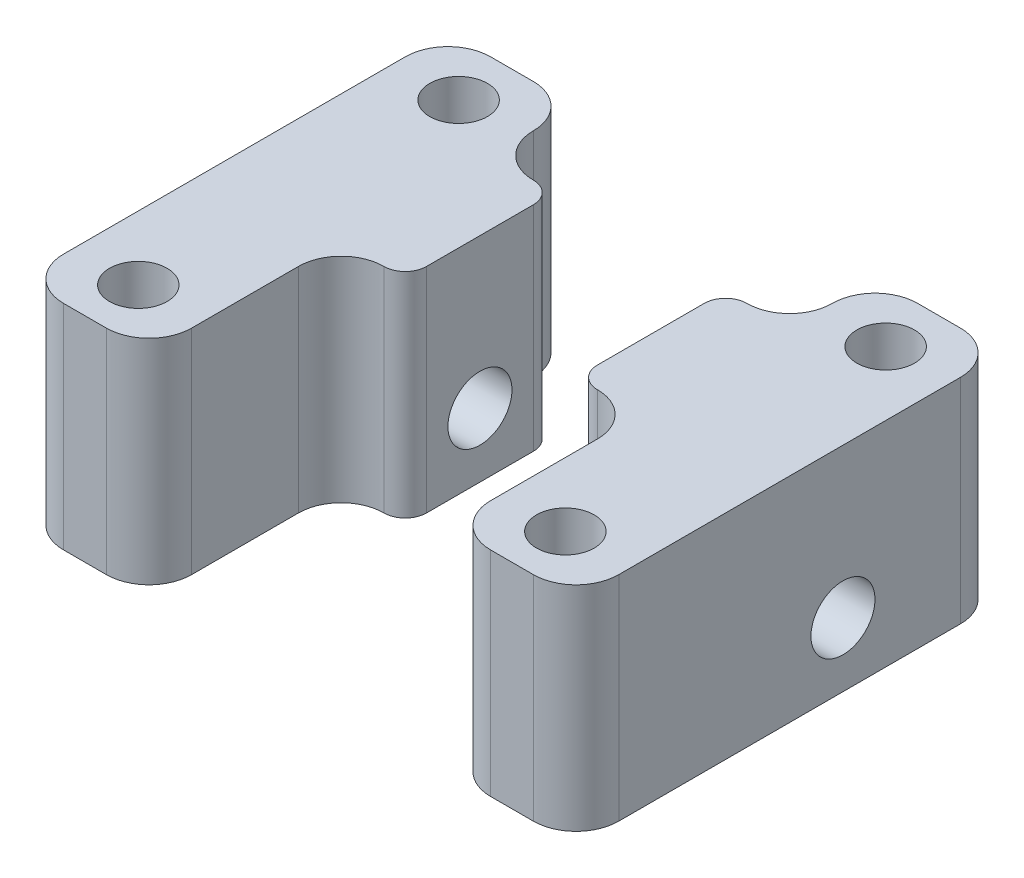
ISO-10303-21;
HEADER;
FILE_DESCRIPTION(('STEP AP214'),'2;1');
FILE_NAME('part.step','',(''),(''),'','','');
FILE_SCHEMA(('AUTOMOTIVE_DESIGN { 1 0 10303 214 1 1 1 1 }'));
ENDSEC;
DATA;
#1=APPLICATION_CONTEXT('core data for automotive mechanical design processes');
#2=APPLICATION_PROTOCOL_DEFINITION('international standard','automotive_design',2000,#1);
#3=PRODUCT_CONTEXT('',#1,'mechanical');
#4=PRODUCT('Part','Part','',(#3));
#5=PRODUCT_RELATED_PRODUCT_CATEGORY('part','',(#4));
#6=PRODUCT_DEFINITION_FORMATION('','',#4);
#7=PRODUCT_DEFINITION_CONTEXT('part definition',#1,'design');
#8=PRODUCT_DEFINITION('design','',#6,#7);
#9=PRODUCT_DEFINITION_SHAPE('','',#8);
#10=(LENGTH_UNIT() NAMED_UNIT(*) SI_UNIT(.MILLI.,.METRE.));
#11=(NAMED_UNIT(*) PLANE_ANGLE_UNIT() SI_UNIT($,.RADIAN.));
#12=(NAMED_UNIT(*) SI_UNIT($,.STERADIAN.) SOLID_ANGLE_UNIT());
#13=UNCERTAINTY_MEASURE_WITH_UNIT(LENGTH_MEASURE(1.E-05),#10,'distance_accuracy_value','');
#14=(GEOMETRIC_REPRESENTATION_CONTEXT(3) GLOBAL_UNCERTAINTY_ASSIGNED_CONTEXT((#13)) GLOBAL_UNIT_ASSIGNED_CONTEXT((#10,
#11,#12)) REPRESENTATION_CONTEXT('',''));
#15=CARTESIAN_POINT('',(0.,0.,0.));
#16=DIRECTION('',(0.,0.,1.));
#17=DIRECTION('',(1.,0.,0.));
#18=AXIS2_PLACEMENT_3D('',#15,#16,#17);
#19=CARTESIAN_POINT('',(0.,10.,0.));
#20=DIRECTION('',(0.,-1.,0.));
#21=DIRECTION('',(0.,0.,1.));
#22=AXIS2_PLACEMENT_3D('',#19,#20,#21);
#23=PLANE('',#22);
#24=CARTESIAN_POINT('',(-10.,10.,-7.5));
#25=DIRECTION('',(0.,-1.,0.));
#26=DIRECTION('',(0.,0.,1.));
#27=AXIS2_PLACEMENT_3D('',#24,#25,#26);
#28=CIRCLE('',#27,1.35);
#29=CARTESIAN_POINT('',(-10.,10.,-6.15));
#30=VERTEX_POINT('',#29);
#31=EDGE_CURVE('E162',#30,#30,#28,.T.);
#32=ORIENTED_EDGE('',*,*,#31,.T.);
#33=EDGE_LOOP('',(#32));
#34=FACE_BOUND('',#33,.T.);
#35=CARTESIAN_POINT('',(-10.,10.,7.5));
#36=DIRECTION('',(0.,-1.,0.));
#37=DIRECTION('',(0.,0.,-1.));
#38=AXIS2_PLACEMENT_3D('',#35,#36,#37);
#39=CIRCLE('',#38,1.35);
#40=CARTESIAN_POINT('',(-10.,10.,6.15));
#41=VERTEX_POINT('',#40);
#42=EDGE_CURVE('E219',#41,#41,#39,.T.);
#43=ORIENTED_EDGE('',*,*,#42,.T.);
#44=EDGE_LOOP('',(#43));
#45=FACE_BOUND('',#44,.T.);
#46=DIRECTION('',(0.,0.,1.));
#47=VECTOR('',#46,1.);
#48=CARTESIAN_POINT('',(-4.,10.,-6.));
#49=LINE('',#48,#47);
#50=CARTESIAN_POINT('',(-4.,10.,-5.));
#51=VERTEX_POINT('',#50);
#52=CARTESIAN_POINT('',(-4.,10.,0.));
#53=VERTEX_POINT('',#52);
#54=EDGE_CURVE('E206',#51,#53,#49,.T.);
#55=ORIENTED_EDGE('',*,*,#54,.F.);
#56=CARTESIAN_POINT('',(-5.,10.,-5.));
#57=DIRECTION('',(0.,1.,0.));
#58=DIRECTION('',(0.,0.,1.));
#59=AXIS2_PLACEMENT_3D('',#56,#57,#58);
#60=CIRCLE('',#59,1.);
#61=CARTESIAN_POINT('',(-5.,10.,-6.));
#62=VERTEX_POINT('',#61);
#63=EDGE_CURVE('E55',#62,#51,#60,.F.);
#64=ORIENTED_EDGE('',*,*,#63,.F.);
#65=CARTESIAN_POINT('',(-5.,10.,-8.));
#66=DIRECTION('',(0.,1.,0.));
#67=DIRECTION('',(0.,0.,1.));
#68=AXIS2_PLACEMENT_3D('',#65,#66,#67);
#69=CIRCLE('',#68,2.);
#70=CARTESIAN_POINT('',(-7.,10.,-8.));
#71=VERTEX_POINT('',#70);
#72=EDGE_CURVE('E190',#71,#62,#69,.T.);
#73=ORIENTED_EDGE('',*,*,#72,.F.);
#74=CARTESIAN_POINT('',(-9.,10.,-8.));
#75=DIRECTION('',(0.,1.,0.));
#76=DIRECTION('',(0.,0.,1.));
#77=AXIS2_PLACEMENT_3D('',#74,#75,#76);
#78=CIRCLE('',#77,2.);
#79=CARTESIAN_POINT('',(-9.,10.,-10.));
#80=VERTEX_POINT('',#79);
#81=EDGE_CURVE('E169',#80,#71,#78,.F.);
#82=ORIENTED_EDGE('',*,*,#81,.F.);
#83=DIRECTION('',(1.,0.,0.));
#84=VECTOR('',#83,1.);
#85=CARTESIAN_POINT('',(-13.,10.,-10.));
#86=LINE('',#85,#84);
#87=CARTESIAN_POINT('',(-11.,10.,-10.));
#88=VERTEX_POINT('',#87);
#89=EDGE_CURVE('E207',#88,#80,#86,.T.);
#90=ORIENTED_EDGE('',*,*,#89,.F.);
#91=CARTESIAN_POINT('',(-11.,10.,-8.));
#92=DIRECTION('',(0.,1.,0.));
#93=DIRECTION('',(0.,0.,1.));
#94=AXIS2_PLACEMENT_3D('',#91,#92,#93);
#95=CIRCLE('',#94,2.);
#96=CARTESIAN_POINT('',(-13.,10.,-8.));
#97=VERTEX_POINT('',#96);
#98=EDGE_CURVE('E175',#97,#88,#95,.F.);
#99=ORIENTED_EDGE('',*,*,#98,.F.);
#100=DIRECTION('',(0.,0.,-1.));
#101=VECTOR('',#100,1.);
#102=CARTESIAN_POINT('',(-13.,10.,-10.));
#103=LINE('',#102,#101);
#104=CARTESIAN_POINT('',(-13.,10.,8.));
#105=VERTEX_POINT('',#104);
#106=EDGE_CURVE('E221',#105,#97,#103,.T.);
#107=ORIENTED_EDGE('',*,*,#106,.F.);
#108=CARTESIAN_POINT('',(-11.,10.,8.));
#109=DIRECTION('',(0.,1.,0.));
#110=DIRECTION('',(0.,0.,1.));
#111=AXIS2_PLACEMENT_3D('',#108,#109,#110);
#112=CIRCLE('',#111,2.);
#113=CARTESIAN_POINT('',(-11.,10.,10.));
#114=VERTEX_POINT('',#113);
#115=EDGE_CURVE('E168',#114,#105,#112,.F.);
#116=ORIENTED_EDGE('',*,*,#115,.F.);
#117=DIRECTION('',(-1.,0.,0.));
#118=VECTOR('',#117,1.);
#119=CARTESIAN_POINT('',(-13.,10.,10.));
#120=LINE('',#119,#118);
#121=CARTESIAN_POINT('',(-9.,10.,10.));
#122=VERTEX_POINT('',#121);
#123=EDGE_CURVE('E167',#122,#114,#120,.T.);
#124=ORIENTED_EDGE('',*,*,#123,.F.);
#125=CARTESIAN_POINT('',(-9.,10.,8.));
#126=DIRECTION('',(0.,1.,0.));
#127=DIRECTION('',(0.,0.,1.));
#128=AXIS2_PLACEMENT_3D('',#125,#126,#127);
#129=CIRCLE('',#128,2.);
#130=CARTESIAN_POINT('',(-7.,10.,8.));
#131=VERTEX_POINT('',#130);
#132=EDGE_CURVE('E147',#131,#122,#129,.F.);
#133=ORIENTED_EDGE('',*,*,#132,.F.);
#134=DIRECTION('',(0.,0.,-1.));
#135=VECTOR('',#134,1.);
#136=CARTESIAN_POINT('',(-7.,10.,10.));
#137=LINE('',#136,#135);
#138=CARTESIAN_POINT('',(-7.,10.,3.));
#139=VERTEX_POINT('',#138);
#140=EDGE_CURVE('E155',#131,#139,#137,.T.);
#141=ORIENTED_EDGE('',*,*,#140,.T.);
#142=CARTESIAN_POINT('',(-5.,10.,3.));
#143=DIRECTION('',(0.,1.,0.));
#144=DIRECTION('',(0.,0.,1.));
#145=AXIS2_PLACEMENT_3D('',#142,#143,#144);
#146=CIRCLE('',#145,2.);
#147=CARTESIAN_POINT('',(-5.,10.,0.999999999999997));
#148=VERTEX_POINT('',#147);
#149=EDGE_CURVE('E185',#148,#139,#146,.T.);
#150=ORIENTED_EDGE('',*,*,#149,.F.);
#151=CARTESIAN_POINT('',(-5.,10.,0.));
#152=DIRECTION('',(0.,1.,0.));
#153=DIRECTION('',(0.,0.,1.));
#154=AXIS2_PLACEMENT_3D('',#151,#152,#153);
#155=CIRCLE('',#154,1.);
#156=EDGE_CURVE('E12',#53,#148,#155,.F.);
#157=ORIENTED_EDGE('',*,*,#156,.F.);
#158=EDGE_LOOP('',(#55,#64,#73,#82,#90,#99,#107,#116,#124,#133,#141,#150,#157));
#159=FACE_BOUND('',#158,.T.);
#160=ADVANCED_FACE('F47',(#34,#45,#159),#23,.F.);
#161=CARTESIAN_POINT('',(0.,0.,0.));
#162=DIRECTION('',(0.,-1.,0.));
#163=DIRECTION('',(0.,0.,1.));
#164=AXIS2_PLACEMENT_3D('',#161,#162,#163);
#165=PLANE('',#164);
#166=CARTESIAN_POINT('',(-5.,0.,3.));
#167=DIRECTION('',(0.,1.,0.));
#168=DIRECTION('',(0.,0.,1.));
#169=AXIS2_PLACEMENT_3D('',#166,#167,#168);
#170=CIRCLE('',#169,2.);
#171=CARTESIAN_POINT('',(-7.,0.,3.));
#172=VERTEX_POINT('',#171);
#173=CARTESIAN_POINT('',(-5.,0.,0.999999999999997));
#174=VERTEX_POINT('',#173);
#175=EDGE_CURVE('E182',#172,#174,#170,.F.);
#176=ORIENTED_EDGE('',*,*,#175,.F.);
#177=DIRECTION('',(0.,0.,-1.));
#178=VECTOR('',#177,1.);
#179=CARTESIAN_POINT('',(-7.,0.,10.));
#180=LINE('',#179,#178);
#181=CARTESIAN_POINT('',(-7.,0.,8.));
#182=VERTEX_POINT('',#181);
#183=EDGE_CURVE('E224',#182,#172,#180,.T.);
#184=ORIENTED_EDGE('',*,*,#183,.F.);
#185=CARTESIAN_POINT('',(-9.,0.,8.));
#186=DIRECTION('',(0.,1.,0.));
#187=DIRECTION('',(0.,0.,1.));
#188=AXIS2_PLACEMENT_3D('',#185,#186,#187);
#189=CIRCLE('',#188,2.);
#190=CARTESIAN_POINT('',(-9.,0.,10.));
#191=VERTEX_POINT('',#190);
#192=EDGE_CURVE('E150',#191,#182,#189,.T.);
#193=ORIENTED_EDGE('',*,*,#192,.F.);
#194=DIRECTION('',(-1.,0.,0.));
#195=VECTOR('',#194,1.);
#196=CARTESIAN_POINT('',(-13.,0.,10.));
#197=LINE('',#196,#195);
#198=CARTESIAN_POINT('',(-11.,0.,10.));
#199=VERTEX_POINT('',#198);
#200=EDGE_CURVE('E228',#191,#199,#197,.T.);
#201=ORIENTED_EDGE('',*,*,#200,.T.);
#202=CARTESIAN_POINT('',(-11.,0.,8.));
#203=DIRECTION('',(0.,1.,0.));
#204=DIRECTION('',(0.,0.,1.));
#205=AXIS2_PLACEMENT_3D('',#202,#203,#204);
#206=CIRCLE('',#205,2.);
#207=CARTESIAN_POINT('',(-13.,0.,8.));
#208=VERTEX_POINT('',#207);
#209=EDGE_CURVE('E259',#208,#199,#206,.T.);
#210=ORIENTED_EDGE('',*,*,#209,.F.);
#211=DIRECTION('',(0.,0.,-1.));
#212=VECTOR('',#211,1.);
#213=CARTESIAN_POINT('',(-13.,0.,-10.));
#214=LINE('',#213,#212);
#215=CARTESIAN_POINT('',(-13.,0.,-8.));
#216=VERTEX_POINT('',#215);
#217=EDGE_CURVE('E216',#208,#216,#214,.T.);
#218=ORIENTED_EDGE('',*,*,#217,.T.);
#219=CARTESIAN_POINT('',(-11.,0.,-8.));
#220=DIRECTION('',(0.,1.,0.));
#221=DIRECTION('',(0.,0.,1.));
#222=AXIS2_PLACEMENT_3D('',#219,#220,#221);
#223=CIRCLE('',#222,2.);
#224=CARTESIAN_POINT('',(-11.,0.,-10.));
#225=VERTEX_POINT('',#224);
#226=EDGE_CURVE('E252',#225,#216,#223,.T.);
#227=ORIENTED_EDGE('',*,*,#226,.F.);
#228=DIRECTION('',(1.,0.,0.));
#229=VECTOR('',#228,1.);
#230=CARTESIAN_POINT('',(-13.,0.,-10.));
#231=LINE('',#230,#229);
#232=CARTESIAN_POINT('',(-9.,0.,-10.));
#233=VERTEX_POINT('',#232);
#234=EDGE_CURVE('E220',#225,#233,#231,.T.);
#235=ORIENTED_EDGE('',*,*,#234,.T.);
#236=CARTESIAN_POINT('',(-9.,0.,-8.));
#237=DIRECTION('',(0.,1.,0.));
#238=DIRECTION('',(0.,0.,1.));
#239=AXIS2_PLACEMENT_3D('',#236,#237,#238);
#240=CIRCLE('',#239,2.);
#241=CARTESIAN_POINT('',(-7.,0.,-8.));
#242=VERTEX_POINT('',#241);
#243=EDGE_CURVE('E255',#242,#233,#240,.T.);
#244=ORIENTED_EDGE('',*,*,#243,.F.);
#245=CARTESIAN_POINT('',(-5.,0.,-8.));
#246=DIRECTION('',(0.,1.,0.));
#247=DIRECTION('',(0.,0.,1.));
#248=AXIS2_PLACEMENT_3D('',#245,#246,#247);
#249=CIRCLE('',#248,2.);
#250=CARTESIAN_POINT('',(-5.,0.,-6.));
#251=VERTEX_POINT('',#250);
#252=EDGE_CURVE('E187',#251,#242,#249,.F.);
#253=ORIENTED_EDGE('',*,*,#252,.F.);
#254=CARTESIAN_POINT('',(-5.,0.,-5.));
#255=DIRECTION('',(0.,1.,0.));
#256=DIRECTION('',(0.,0.,1.));
#257=AXIS2_PLACEMENT_3D('',#254,#255,#256);
#258=CIRCLE('',#257,1.);
#259=CARTESIAN_POINT('',(-4.,0.,-5.));
#260=VERTEX_POINT('',#259);
#261=EDGE_CURVE('E193',#260,#251,#258,.T.);
#262=ORIENTED_EDGE('',*,*,#261,.F.);
#263=DIRECTION('',(0.,0.,-1.));
#264=VECTOR('',#263,1.);
#265=CARTESIAN_POINT('',(-4.,0.,-6.));
#266=LINE('',#265,#264);
#267=CARTESIAN_POINT('',(-4.,0.,0.));
#268=VERTEX_POINT('',#267);
#269=EDGE_CURVE('E208',#268,#260,#266,.T.);
#270=ORIENTED_EDGE('',*,*,#269,.F.);
#271=CARTESIAN_POINT('',(-5.,0.,0.));
#272=DIRECTION('',(0.,1.,0.));
#273=DIRECTION('',(0.,0.,1.));
#274=AXIS2_PLACEMENT_3D('',#271,#272,#273);
#275=CIRCLE('',#274,1.);
#276=EDGE_CURVE('E199',#174,#268,#275,.T.);
#277=ORIENTED_EDGE('',*,*,#276,.F.);
#278=EDGE_LOOP('',(#176,#184,#193,#201,#210,#218,#227,#235,#244,#253,#262,#270,#277));
#279=FACE_BOUND('',#278,.T.);
#280=CARTESIAN_POINT('',(-10.,0.,-7.5));
#281=DIRECTION('',(0.,-1.,0.));
#282=DIRECTION('',(0.,0.,1.));
#283=AXIS2_PLACEMENT_3D('',#280,#281,#282);
#284=CIRCLE('',#283,1.35);
#285=CARTESIAN_POINT('',(-10.,0.,-6.15));
#286=VERTEX_POINT('',#285);
#287=EDGE_CURVE('E229',#286,#286,#284,.T.);
#288=ORIENTED_EDGE('',*,*,#287,.F.);
#289=EDGE_LOOP('',(#288));
#290=FACE_BOUND('',#289,.T.);
#291=CARTESIAN_POINT('',(-10.,0.,7.5));
#292=DIRECTION('',(0.,-1.,0.));
#293=DIRECTION('',(0.,0.,-1.));
#294=AXIS2_PLACEMENT_3D('',#291,#292,#293);
#295=CIRCLE('',#294,1.35);
#296=CARTESIAN_POINT('',(-10.,0.,6.15));
#297=VERTEX_POINT('',#296);
#298=EDGE_CURVE('E225',#297,#297,#295,.T.);
#299=ORIENTED_EDGE('',*,*,#298,.F.);
#300=EDGE_LOOP('',(#299));
#301=FACE_BOUND('',#300,.T.);
#302=ADVANCED_FACE('F279',(#279,#290,#301),#165,.T.);
#303=CARTESIAN_POINT('',(-13.,10.,10.));
#304=DIRECTION('',(0.,0.,-1.));
#305=DIRECTION('',(1.,0.,0.));
#306=AXIS2_PLACEMENT_3D('',#303,#304,#305);
#307=PLANE('',#306);
#308=ORIENTED_EDGE('',*,*,#200,.F.);
#309=DIRECTION('',(0.,1.,0.));
#310=VECTOR('',#309,1.);
#311=CARTESIAN_POINT('',(-9.,10.,10.));
#312=LINE('',#311,#310);
#313=EDGE_CURVE('E262',#122,#191,#312,.F.);
#314=ORIENTED_EDGE('',*,*,#313,.F.);
#315=ORIENTED_EDGE('',*,*,#123,.T.);
#316=DIRECTION('',(0.,-1.,0.));
#317=VECTOR('',#316,1.);
#318=CARTESIAN_POINT('',(-11.,10.,10.));
#319=LINE('',#318,#317);
#320=EDGE_CURVE('E264',#199,#114,#319,.F.);
#321=ORIENTED_EDGE('',*,*,#320,.F.);
#322=EDGE_LOOP('',(#308,#314,#315,#321));
#323=FACE_BOUND('',#322,.T.);
#324=ADVANCED_FACE('F289',(#323),#307,.F.);
#325=CARTESIAN_POINT('',(-13.,10.,-10.));
#326=DIRECTION('',(0.,0.,1.));
#327=DIRECTION('',(-1.,0.,0.));
#328=AXIS2_PLACEMENT_3D('',#325,#326,#327);
#329=PLANE('',#328);
#330=ORIENTED_EDGE('',*,*,#234,.F.);
#331=DIRECTION('',(0.,-1.,0.));
#332=VECTOR('',#331,1.);
#333=CARTESIAN_POINT('',(-11.,10.,-10.));
#334=LINE('',#333,#332);
#335=EDGE_CURVE('E172',#88,#225,#334,.T.);
#336=ORIENTED_EDGE('',*,*,#335,.F.);
#337=ORIENTED_EDGE('',*,*,#89,.T.);
#338=DIRECTION('',(0.,1.,0.));
#339=VECTOR('',#338,1.);
#340=CARTESIAN_POINT('',(-9.,10.,-10.));
#341=LINE('',#340,#339);
#342=EDGE_CURVE('E180',#233,#80,#341,.T.);
#343=ORIENTED_EDGE('',*,*,#342,.F.);
#344=EDGE_LOOP('',(#330,#336,#337,#343));
#345=FACE_BOUND('',#344,.T.);
#346=ADVANCED_FACE('F274',(#345),#329,.F.);
#347=CARTESIAN_POINT('',(-13.,10.,-10.));
#348=DIRECTION('',(1.,0.,0.));
#349=DIRECTION('',(0.,0.,1.));
#350=AXIS2_PLACEMENT_3D('',#347,#348,#349);
#351=PLANE('',#350);
#352=CARTESIAN_POINT('',(-13.,3.,-2.5));
#353=DIRECTION('',(-1.,0.,0.));
#354=DIRECTION('',(0.,0.,1.));
#355=AXIS2_PLACEMENT_3D('',#352,#353,#354);
#356=CIRCLE('',#355,1.5);
#357=CARTESIAN_POINT('',(-13.,3.,-0.999999999999998));
#358=VERTEX_POINT('',#357);
#359=EDGE_CURVE('E196',#358,#358,#356,.T.);
#360=ORIENTED_EDGE('',*,*,#359,.F.);
#361=EDGE_LOOP('',(#360));
#362=FACE_BOUND('',#361,.T.);
#363=ORIENTED_EDGE('',*,*,#106,.T.);
#364=DIRECTION('',(0.,-1.,0.));
#365=VECTOR('',#364,1.);
#366=CARTESIAN_POINT('',(-13.,10.,-8.));
#367=LINE('',#366,#365);
#368=EDGE_CURVE('E248',#216,#97,#367,.F.);
#369=ORIENTED_EDGE('',*,*,#368,.F.);
#370=ORIENTED_EDGE('',*,*,#217,.F.);
#371=DIRECTION('',(0.,-1.,0.));
#372=VECTOR('',#371,1.);
#373=CARTESIAN_POINT('',(-13.,10.,8.));
#374=LINE('',#373,#372);
#375=EDGE_CURVE('E250',#105,#208,#374,.T.);
#376=ORIENTED_EDGE('',*,*,#375,.F.);
#377=EDGE_LOOP('',(#363,#369,#370,#376));
#378=FACE_BOUND('',#377,.T.);
#379=ADVANCED_FACE('F284',(#362,#378),#351,.F.);
#380=CARTESIAN_POINT('',(-10.,10.,7.5));
#381=DIRECTION('',(0.,-1.,0.));
#382=DIRECTION('',(0.,0.,1.));
#383=AXIS2_PLACEMENT_3D('',#380,#381,#382);
#384=CYLINDRICAL_SURFACE('',#383,1.35);
#385=ORIENTED_EDGE('',*,*,#42,.F.);
#386=EDGE_LOOP('',(#385));
#387=FACE_BOUND('',#386,.T.);
#388=ORIENTED_EDGE('',*,*,#298,.T.);
#389=EDGE_LOOP('',(#388));
#390=FACE_BOUND('',#389,.T.);
#391=ADVANCED_FACE('F399',(#387,#390),#384,.F.);
#392=CARTESIAN_POINT('',(-10.,10.,-7.5));
#393=DIRECTION('',(0.,-1.,0.));
#394=DIRECTION('',(0.,0.,1.));
#395=AXIS2_PLACEMENT_3D('',#392,#393,#394);
#396=CYLINDRICAL_SURFACE('',#395,1.35);
#397=ORIENTED_EDGE('',*,*,#31,.F.);
#398=EDGE_LOOP('',(#397));
#399=FACE_BOUND('',#398,.T.);
#400=ORIENTED_EDGE('',*,*,#287,.T.);
#401=EDGE_LOOP('',(#400));
#402=FACE_BOUND('',#401,.T.);
#403=ADVANCED_FACE('F391',(#399,#402),#396,.F.);
#404=CARTESIAN_POINT('',(-7.,0.,10.));
#405=DIRECTION('',(-1.,0.,0.));
#406=DIRECTION('',(0.,0.,-1.));
#407=AXIS2_PLACEMENT_3D('',#404,#405,#406);
#408=PLANE('',#407);
#409=ORIENTED_EDGE('',*,*,#140,.F.);
#410=DIRECTION('',(0.,1.,0.));
#411=VECTOR('',#410,1.);
#412=CARTESIAN_POINT('',(-7.,0.,8.));
#413=LINE('',#412,#411);
#414=EDGE_CURVE('E143',#182,#131,#413,.T.);
#415=ORIENTED_EDGE('',*,*,#414,.F.);
#416=ORIENTED_EDGE('',*,*,#183,.T.);
#417=DIRECTION('',(0.,-1.,0.));
#418=VECTOR('',#417,1.);
#419=CARTESIAN_POINT('',(-7.,0.,3.));
#420=LINE('',#419,#418);
#421=EDGE_CURVE('E154',#139,#172,#420,.T.);
#422=ORIENTED_EDGE('',*,*,#421,.F.);
#423=EDGE_LOOP('',(#409,#415,#416,#422));
#424=FACE_BOUND('',#423,.T.);
#425=ADVANCED_FACE('F158',(#424),#408,.F.);
#426=CARTESIAN_POINT('',(-4.,17.6157731058639,-6.));
#427=DIRECTION('',(1.,0.,0.));
#428=DIRECTION('',(0.,0.,1.));
#429=AXIS2_PLACEMENT_3D('',#426,#427,#428);
#430=PLANE('',#429);
#431=CARTESIAN_POINT('',(-4.,3.,-2.5));
#432=DIRECTION('',(-1.,0.,0.));
#433=DIRECTION('',(0.,0.,1.));
#434=AXIS2_PLACEMENT_3D('',#431,#432,#433);
#435=CIRCLE('',#434,1.5);
#436=CARTESIAN_POINT('',(-4.,3.,-0.999999999999998));
#437=VERTEX_POINT('',#436);
#438=EDGE_CURVE('E212',#437,#437,#435,.T.);
#439=ORIENTED_EDGE('',*,*,#438,.T.);
#440=EDGE_LOOP('',(#439));
#441=FACE_BOUND('',#440,.T.);
#442=ORIENTED_EDGE('',*,*,#269,.T.);
#443=DIRECTION('',(0.,-1.,0.));
#444=VECTOR('',#443,1.);
#445=CARTESIAN_POINT('',(-4.,17.6157731058639,-5.));
#446=LINE('',#445,#444);
#447=EDGE_CURVE('E69',#51,#260,#446,.T.);
#448=ORIENTED_EDGE('',*,*,#447,.F.);
#449=ORIENTED_EDGE('',*,*,#54,.T.);
#450=DIRECTION('',(0.,-1.,0.));
#451=VECTOR('',#450,1.);
#452=CARTESIAN_POINT('',(-4.,17.6157731058639,0.));
#453=LINE('',#452,#451);
#454=EDGE_CURVE('E61',#268,#53,#453,.F.);
#455=ORIENTED_EDGE('',*,*,#454,.F.);
#456=EDGE_LOOP('',(#442,#448,#449,#455));
#457=FACE_BOUND('',#456,.T.);
#458=ADVANCED_FACE('F374',(#441,#457),#430,.T.);
#459=CARTESIAN_POINT('',(-13.,3.,-2.5));
#460=DIRECTION('',(1.,0.,0.));
#461=DIRECTION('',(0.,0.,1.));
#462=AXIS2_PLACEMENT_3D('',#459,#460,#461);
#463=CYLINDRICAL_SURFACE('',#462,1.5);
#464=ORIENTED_EDGE('',*,*,#438,.F.);
#465=EDGE_LOOP('',(#464));
#466=FACE_BOUND('',#465,.T.);
#467=ORIENTED_EDGE('',*,*,#359,.T.);
#468=EDGE_LOOP('',(#467));
#469=FACE_BOUND('',#468,.T.);
#470=ADVANCED_FACE('F314',(#466,#469),#463,.F.);
#471=CARTESIAN_POINT('',(-5.,0.,3.));
#472=DIRECTION('',(0.,-1.,0.));
#473=DIRECTION('',(0.,0.,1.));
#474=AXIS2_PLACEMENT_3D('',#471,#472,#473);
#475=CYLINDRICAL_SURFACE('',#474,2.);
#476=ORIENTED_EDGE('',*,*,#149,.T.);
#477=ORIENTED_EDGE('',*,*,#421,.T.);
#478=ORIENTED_EDGE('',*,*,#175,.T.);
#479=DIRECTION('',(0.,-1.,0.));
#480=VECTOR('',#479,1.);
#481=CARTESIAN_POINT('',(-5.,17.6157731058639,0.999999999999997));
#482=LINE('',#481,#480);
#483=EDGE_CURVE('E245',#174,#148,#482,.F.);
#484=ORIENTED_EDGE('',*,*,#483,.T.);
#485=EDGE_LOOP('',(#476,#477,#478,#484));
#486=FACE_BOUND('',#485,.T.);
#487=ADVANCED_FACE('F293',(#486),#475,.F.);
#488=CARTESIAN_POINT('',(-9.,10.,-8.));
#489=DIRECTION('',(0.,1.,0.));
#490=DIRECTION('',(0.,0.,-1.));
#491=AXIS2_PLACEMENT_3D('',#488,#489,#490);
#492=CYLINDRICAL_SURFACE('',#491,2.);
#493=DIRECTION('',(0.,1.,0.));
#494=VECTOR('',#493,1.);
#495=CARTESIAN_POINT('',(-7.,0.,-8.));
#496=LINE('',#495,#494);
#497=EDGE_CURVE('E194',#71,#242,#496,.F.);
#498=ORIENTED_EDGE('',*,*,#497,.T.);
#499=ORIENTED_EDGE('',*,*,#243,.T.);
#500=ORIENTED_EDGE('',*,*,#342,.T.);
#501=ORIENTED_EDGE('',*,*,#81,.T.);
#502=EDGE_LOOP('',(#498,#499,#500,#501));
#503=FACE_BOUND('',#502,.T.);
#504=ADVANCED_FACE('F313',(#503),#492,.T.);
#505=CARTESIAN_POINT('',(-5.,17.6157731058639,-8.));
#506=DIRECTION('',(0.,-1.,0.));
#507=DIRECTION('',(0.,0.,1.));
#508=AXIS2_PLACEMENT_3D('',#505,#506,#507);
#509=CYLINDRICAL_SURFACE('',#508,2.);
#510=ORIENTED_EDGE('',*,*,#72,.T.);
#511=DIRECTION('',(0.,-1.,0.));
#512=VECTOR('',#511,1.);
#513=CARTESIAN_POINT('',(-5.,17.6157731058639,-6.));
#514=LINE('',#513,#512);
#515=EDGE_CURVE('E204',#62,#251,#514,.T.);
#516=ORIENTED_EDGE('',*,*,#515,.T.);
#517=ORIENTED_EDGE('',*,*,#252,.T.);
#518=ORIENTED_EDGE('',*,*,#497,.F.);
#519=EDGE_LOOP('',(#510,#516,#517,#518));
#520=FACE_BOUND('',#519,.T.);
#521=ADVANCED_FACE('F315',(#520),#509,.F.);
#522=CARTESIAN_POINT('',(-11.,10.,8.));
#523=DIRECTION('',(0.,-1.,0.));
#524=DIRECTION('',(0.,0.,1.));
#525=AXIS2_PLACEMENT_3D('',#522,#523,#524);
#526=CYLINDRICAL_SURFACE('',#525,2.);
#527=ORIENTED_EDGE('',*,*,#115,.T.);
#528=ORIENTED_EDGE('',*,*,#375,.T.);
#529=ORIENTED_EDGE('',*,*,#209,.T.);
#530=ORIENTED_EDGE('',*,*,#320,.T.);
#531=EDGE_LOOP('',(#527,#528,#529,#530));
#532=FACE_BOUND('',#531,.T.);
#533=ADVANCED_FACE('F286',(#532),#526,.T.);
#534=CARTESIAN_POINT('',(-9.,0.,8.));
#535=DIRECTION('',(0.,1.,0.));
#536=DIRECTION('',(0.,0.,-1.));
#537=AXIS2_PLACEMENT_3D('',#534,#535,#536);
#538=CYLINDRICAL_SURFACE('',#537,2.);
#539=ORIENTED_EDGE('',*,*,#192,.T.);
#540=ORIENTED_EDGE('',*,*,#414,.T.);
#541=ORIENTED_EDGE('',*,*,#132,.T.);
#542=ORIENTED_EDGE('',*,*,#313,.T.);
#543=EDGE_LOOP('',(#539,#540,#541,#542));
#544=FACE_BOUND('',#543,.T.);
#545=ADVANCED_FACE('F145',(#544),#538,.T.);
#546=CARTESIAN_POINT('',(-11.,10.,-8.));
#547=DIRECTION('',(0.,-1.,0.));
#548=DIRECTION('',(0.,0.,1.));
#549=AXIS2_PLACEMENT_3D('',#546,#547,#548);
#550=CYLINDRICAL_SURFACE('',#549,2.);
#551=ORIENTED_EDGE('',*,*,#98,.T.);
#552=ORIENTED_EDGE('',*,*,#335,.T.);
#553=ORIENTED_EDGE('',*,*,#226,.T.);
#554=ORIENTED_EDGE('',*,*,#368,.T.);
#555=EDGE_LOOP('',(#551,#552,#553,#554));
#556=FACE_BOUND('',#555,.T.);
#557=ADVANCED_FACE('F269',(#556),#550,.T.);
#558=CARTESIAN_POINT('',(-5.,17.6157731058639,0.));
#559=DIRECTION('',(0.,-1.,0.));
#560=DIRECTION('',(0.,0.,1.));
#561=AXIS2_PLACEMENT_3D('',#558,#559,#560);
#562=CYLINDRICAL_SURFACE('',#561,1.);
#563=ORIENTED_EDGE('',*,*,#156,.T.);
#564=ORIENTED_EDGE('',*,*,#483,.F.);
#565=ORIENTED_EDGE('',*,*,#276,.T.);
#566=ORIENTED_EDGE('',*,*,#454,.T.);
#567=EDGE_LOOP('',(#563,#564,#565,#566));
#568=FACE_BOUND('',#567,.T.);
#569=ADVANCED_FACE('F294',(#568),#562,.T.);
#570=CARTESIAN_POINT('',(-5.,17.6157731058639,-5.));
#571=DIRECTION('',(0.,-1.,0.));
#572=DIRECTION('',(0.,0.,1.));
#573=AXIS2_PLACEMENT_3D('',#570,#571,#572);
#574=CYLINDRICAL_SURFACE('',#573,1.);
#575=ORIENTED_EDGE('',*,*,#63,.T.);
#576=ORIENTED_EDGE('',*,*,#447,.T.);
#577=ORIENTED_EDGE('',*,*,#261,.T.);
#578=ORIENTED_EDGE('',*,*,#515,.F.);
#579=EDGE_LOOP('',(#575,#576,#577,#578));
#580=FACE_BOUND('',#579,.T.);
#581=ADVANCED_FACE('F49',(#580),#574,.T.);
#582=CLOSED_SHELL('',(#160,#302,#324,#346,#379,#391,#403,#425,#458,#470,#487,#504,#521,#533,
#545,#557,#569,#581));
#583=MANIFOLD_SOLID_BREP('B2',#582);
#584=CARTESIAN_POINT('',(7.,0.,10.));
#585=DIRECTION('',(1.,0.,0.));
#586=DIRECTION('',(0.,0.,1.));
#587=AXIS2_PLACEMENT_3D('',#584,#585,#586);
#588=PLANE('',#587);
#589=DIRECTION('',(0.,0.,1.));
#590=VECTOR('',#589,1.);
#591=CARTESIAN_POINT('',(7.,0.,10.));
#592=LINE('',#591,#590);
#593=CARTESIAN_POINT('',(7.,0.,3.));
#594=VERTEX_POINT('',#593);
#595=CARTESIAN_POINT('',(7.,0.,8.));
#596=VERTEX_POINT('',#595);
#597=EDGE_CURVE('E688',#594,#596,#592,.T.);
#598=ORIENTED_EDGE('',*,*,#597,.T.);
#599=DIRECTION('',(0.,1.,0.));
#600=VECTOR('',#599,1.);
#601=CARTESIAN_POINT('',(7.,0.,8.));
#602=LINE('',#601,#600);
#603=CARTESIAN_POINT('',(7.,10.,8.));
#604=VERTEX_POINT('',#603);
#605=EDGE_CURVE('E575',#604,#596,#602,.F.);
#606=ORIENTED_EDGE('',*,*,#605,.F.);
#607=DIRECTION('',(0.,0.,1.));
#608=VECTOR('',#607,1.);
#609=CARTESIAN_POINT('',(7.,10.,10.));
#610=LINE('',#609,#608);
#611=CARTESIAN_POINT('',(7.,10.,3.));
#612=VERTEX_POINT('',#611);
#613=EDGE_CURVE('E690',#612,#604,#610,.T.);
#614=ORIENTED_EDGE('',*,*,#613,.F.);
#615=DIRECTION('',(0.,-1.,0.));
#616=VECTOR('',#615,1.);
#617=CARTESIAN_POINT('',(7.,0.,3.));
#618=LINE('',#617,#616);
#619=EDGE_CURVE('E588',#594,#612,#618,.F.);
#620=ORIENTED_EDGE('',*,*,#619,.F.);
#621=EDGE_LOOP('',(#598,#606,#614,#620));
#622=FACE_BOUND('',#621,.T.);
#623=ADVANCED_FACE('F474',(#622),#588,.F.);
#624=CARTESIAN_POINT('',(10.,10.,7.5));
#625=DIRECTION('',(0.,-1.,0.));
#626=DIRECTION('',(0.,0.,1.));
#627=AXIS2_PLACEMENT_3D('',#624,#625,#626);
#628=CYLINDRICAL_SURFACE('',#627,1.35);
#629=CARTESIAN_POINT('',(10.,10.,7.5));
#630=DIRECTION('',(0.,-1.,0.));
#631=DIRECTION('',(0.,0.,1.));
#632=AXIS2_PLACEMENT_3D('',#629,#630,#631);
#633=CIRCLE('',#632,1.35);
#634=CARTESIAN_POINT('',(10.,10.,8.85));
#635=VERTEX_POINT('',#634);
#636=EDGE_CURVE('E674',#635,#635,#633,.T.);
#637=ORIENTED_EDGE('',*,*,#636,.F.);
#638=EDGE_LOOP('',(#637));
#639=FACE_BOUND('',#638,.T.);
#640=CARTESIAN_POINT('',(10.,0.,7.5));
#641=DIRECTION('',(0.,-1.,0.));
#642=DIRECTION('',(0.,0.,1.));
#643=AXIS2_PLACEMENT_3D('',#640,#641,#642);
#644=CIRCLE('',#643,1.35);
#645=CARTESIAN_POINT('',(10.,0.,8.85));
#646=VERTEX_POINT('',#645);
#647=EDGE_CURVE('E700',#646,#646,#644,.T.);
#648=ORIENTED_EDGE('',*,*,#647,.T.);
#649=EDGE_LOOP('',(#648));
#650=FACE_BOUND('',#649,.T.);
#651=ADVANCED_FACE('F737',(#639,#650),#628,.F.);
#652=CARTESIAN_POINT('',(10.,10.,-7.5));
#653=DIRECTION('',(0.,-1.,0.));
#654=DIRECTION('',(0.,0.,1.));
#655=AXIS2_PLACEMENT_3D('',#652,#653,#654);
#656=CYLINDRICAL_SURFACE('',#655,1.35);
#657=CARTESIAN_POINT('',(10.,10.,-7.5));
#658=DIRECTION('',(0.,-1.,0.));
#659=DIRECTION('',(0.,0.,-1.));
#660=AXIS2_PLACEMENT_3D('',#657,#658,#659);
#661=CIRCLE('',#660,1.35);
#662=CARTESIAN_POINT('',(10.,10.,-8.85));
#663=VERTEX_POINT('',#662);
#664=EDGE_CURVE('E693',#663,#663,#661,.T.);
#665=ORIENTED_EDGE('',*,*,#664,.F.);
#666=EDGE_LOOP('',(#665));
#667=FACE_BOUND('',#666,.T.);
#668=CARTESIAN_POINT('',(10.,0.,-7.5));
#669=DIRECTION('',(0.,-1.,0.));
#670=DIRECTION('',(0.,0.,-1.));
#671=AXIS2_PLACEMENT_3D('',#668,#669,#670);
#672=CIRCLE('',#671,1.35);
#673=CARTESIAN_POINT('',(10.,0.,-8.85));
#674=VERTEX_POINT('',#673);
#675=EDGE_CURVE('E689',#674,#674,#672,.T.);
#676=ORIENTED_EDGE('',*,*,#675,.T.);
#677=EDGE_LOOP('',(#676));
#678=FACE_BOUND('',#677,.T.);
#679=ADVANCED_FACE('F742',(#667,#678),#656,.F.);
#680=CARTESIAN_POINT('',(13.,10.,-10.));
#681=DIRECTION('',(-1.,0.,0.));
#682=DIRECTION('',(0.,0.,-1.));
#683=AXIS2_PLACEMENT_3D('',#680,#681,#682);
#684=PLANE('',#683);
#685=CARTESIAN_POINT('',(13.,3.,-2.5));
#686=DIRECTION('',(-1.,0.,0.));
#687=DIRECTION('',(0.,0.,1.));
#688=AXIS2_PLACEMENT_3D('',#685,#686,#687);
#689=CIRCLE('',#688,1.5);
#690=CARTESIAN_POINT('',(13.,3.,-0.999999999999998));
#691=VERTEX_POINT('',#690);
#692=EDGE_CURVE('E604',#691,#691,#689,.T.);
#693=ORIENTED_EDGE('',*,*,#692,.T.);
#694=EDGE_LOOP('',(#693));
#695=FACE_BOUND('',#694,.T.);
#696=DIRECTION('',(0.,0.,1.));
#697=VECTOR('',#696,1.);
#698=CARTESIAN_POINT('',(13.,10.,-10.));
#699=LINE('',#698,#697);
#700=CARTESIAN_POINT('',(13.,10.,-8.));
#701=VERTEX_POINT('',#700);
#702=CARTESIAN_POINT('',(13.,10.,8.));
#703=VERTEX_POINT('',#702);
#704=EDGE_CURVE('E672',#701,#703,#699,.T.);
#705=ORIENTED_EDGE('',*,*,#704,.T.);
#706=DIRECTION('',(0.,-1.,0.));
#707=VECTOR('',#706,1.);
#708=CARTESIAN_POINT('',(13.,10.,8.));
#709=LINE('',#708,#707);
#710=CARTESIAN_POINT('',(13.,0.,8.));
#711=VERTEX_POINT('',#710);
#712=EDGE_CURVE('E621',#711,#703,#709,.F.);
#713=ORIENTED_EDGE('',*,*,#712,.F.);
#714=DIRECTION('',(0.,0.,1.));
#715=VECTOR('',#714,1.);
#716=CARTESIAN_POINT('',(13.,0.,-10.));
#717=LINE('',#716,#715);
#718=CARTESIAN_POINT('',(13.,0.,-8.));
#719=VERTEX_POINT('',#718);
#720=EDGE_CURVE('E669',#719,#711,#717,.T.);
#721=ORIENTED_EDGE('',*,*,#720,.F.);
#722=DIRECTION('',(0.,-1.,0.));
#723=VECTOR('',#722,1.);
#724=CARTESIAN_POINT('',(13.,10.,-8.));
#725=LINE('',#724,#723);
#726=EDGE_CURVE('E624',#701,#719,#725,.T.);
#727=ORIENTED_EDGE('',*,*,#726,.F.);
#728=EDGE_LOOP('',(#705,#713,#721,#727));
#729=FACE_BOUND('',#728,.T.);
#730=ADVANCED_FACE('F750',(#695,#729),#684,.F.);
#731=CARTESIAN_POINT('',(-13.,10.,-10.));
#732=DIRECTION('',(0.,0.,1.));
#733=DIRECTION('',(-1.,0.,0.));
#734=AXIS2_PLACEMENT_3D('',#731,#732,#733);
#735=PLANE('',#734);
#736=DIRECTION('',(1.,0.,0.));
#737=VECTOR('',#736,1.);
#738=CARTESIAN_POINT('',(-13.,0.,-10.));
#739=LINE('',#738,#737);
#740=CARTESIAN_POINT('',(8.99999999999999,0.,-10.));
#741=VERTEX_POINT('',#740);
#742=CARTESIAN_POINT('',(11.,0.,-10.));
#743=VERTEX_POINT('',#742);
#744=EDGE_CURVE('E668',#741,#743,#739,.T.);
#745=ORIENTED_EDGE('',*,*,#744,.F.);
#746=DIRECTION('',(0.,1.,0.));
#747=VECTOR('',#746,1.);
#748=CARTESIAN_POINT('',(9.,10.,-10.));
#749=LINE('',#748,#747);
#750=CARTESIAN_POINT('',(8.99999999999999,10.,-10.));
#751=VERTEX_POINT('',#750);
#752=EDGE_CURVE('E639',#751,#741,#749,.F.);
#753=ORIENTED_EDGE('',*,*,#752,.F.);
#754=DIRECTION('',(1.,0.,0.));
#755=VECTOR('',#754,1.);
#756=CARTESIAN_POINT('',(-13.,10.,-10.));
#757=LINE('',#756,#755);
#758=CARTESIAN_POINT('',(11.,10.,-10.));
#759=VERTEX_POINT('',#758);
#760=EDGE_CURVE('E576',#751,#759,#757,.T.);
#761=ORIENTED_EDGE('',*,*,#760,.T.);
#762=DIRECTION('',(0.,-1.,0.));
#763=VECTOR('',#762,1.);
#764=CARTESIAN_POINT('',(11.,10.,-10.));
#765=LINE('',#764,#763);
#766=EDGE_CURVE('E642',#743,#759,#765,.F.);
#767=ORIENTED_EDGE('',*,*,#766,.F.);
#768=EDGE_LOOP('',(#745,#753,#761,#767));
#769=FACE_BOUND('',#768,.T.);
#770=ADVANCED_FACE('F714',(#769),#735,.F.);
#771=CARTESIAN_POINT('',(-13.,10.,10.));
#772=DIRECTION('',(0.,0.,-1.));
#773=DIRECTION('',(1.,0.,0.));
#774=AXIS2_PLACEMENT_3D('',#771,#772,#773);
#775=PLANE('',#774);
#776=DIRECTION('',(-1.,0.,0.));
#777=VECTOR('',#776,1.);
#778=CARTESIAN_POINT('',(-13.,10.,10.));
#779=LINE('',#778,#777);
#780=CARTESIAN_POINT('',(11.,10.,10.));
#781=VERTEX_POINT('',#780);
#782=CARTESIAN_POINT('',(9.,10.,10.));
#783=VERTEX_POINT('',#782);
#784=EDGE_CURVE('E708',#781,#783,#779,.T.);
#785=ORIENTED_EDGE('',*,*,#784,.T.);
#786=DIRECTION('',(0.,1.,0.));
#787=VECTOR('',#786,1.);
#788=CARTESIAN_POINT('',(9.,10.,10.));
#789=LINE('',#788,#787);
#790=CARTESIAN_POINT('',(9.,0.,10.));
#791=VERTEX_POINT('',#790);
#792=EDGE_CURVE('E652',#791,#783,#789,.T.);
#793=ORIENTED_EDGE('',*,*,#792,.F.);
#794=DIRECTION('',(-1.,0.,0.));
#795=VECTOR('',#794,1.);
#796=CARTESIAN_POINT('',(-13.,0.,10.));
#797=LINE('',#796,#795);
#798=CARTESIAN_POINT('',(11.,0.,10.));
#799=VERTEX_POINT('',#798);
#800=EDGE_CURVE('E665',#799,#791,#797,.T.);
#801=ORIENTED_EDGE('',*,*,#800,.F.);
#802=DIRECTION('',(0.,-1.,0.));
#803=VECTOR('',#802,1.);
#804=CARTESIAN_POINT('',(11.,10.,10.));
#805=LINE('',#804,#803);
#806=EDGE_CURVE('E596',#781,#799,#805,.T.);
#807=ORIENTED_EDGE('',*,*,#806,.F.);
#808=EDGE_LOOP('',(#785,#793,#801,#807));
#809=FACE_BOUND('',#808,.T.);
#810=ADVANCED_FACE('F666',(#809),#775,.F.);
#811=CARTESIAN_POINT('',(0.,0.,0.));
#812=DIRECTION('',(0.,-1.,0.));
#813=DIRECTION('',(0.,0.,1.));
#814=AXIS2_PLACEMENT_3D('',#811,#812,#813);
#815=PLANE('',#814);
#816=DIRECTION('',(0.,0.,1.));
#817=VECTOR('',#816,1.);
#818=CARTESIAN_POINT('',(4.,0.,-6.));
#819=LINE('',#818,#817);
#820=CARTESIAN_POINT('',(4.,0.,-5.));
#821=VERTEX_POINT('',#820);
#822=CARTESIAN_POINT('',(4.,0.,0.));
#823=VERTEX_POINT('',#822);
#824=EDGE_CURVE('E680',#821,#823,#819,.T.);
#825=ORIENTED_EDGE('',*,*,#824,.F.);
#826=CARTESIAN_POINT('',(5.,0.,-5.));
#827=DIRECTION('',(0.,1.,0.));
#828=DIRECTION('',(0.,0.,1.));
#829=AXIS2_PLACEMENT_3D('',#826,#827,#828);
#830=CIRCLE('',#829,1.);
#831=CARTESIAN_POINT('',(5.,0.,-6.));
#832=VERTEX_POINT('',#831);
#833=EDGE_CURVE('E607',#832,#821,#830,.T.);
#834=ORIENTED_EDGE('',*,*,#833,.F.);
#835=CARTESIAN_POINT('',(5.,0.,-8.));
#836=DIRECTION('',(0.,1.,0.));
#837=DIRECTION('',(0.,0.,1.));
#838=AXIS2_PLACEMENT_3D('',#835,#836,#837);
#839=CIRCLE('',#838,2.);
#840=CARTESIAN_POINT('',(7.,0.,-8.));
#841=VERTEX_POINT('',#840);
#842=EDGE_CURVE('E590',#841,#832,#839,.F.);
#843=ORIENTED_EDGE('',*,*,#842,.F.);
#844=CARTESIAN_POINT('',(9.,0.,-8.));
#845=DIRECTION('',(0.,1.,0.));
#846=DIRECTION('',(0.,0.,1.));
#847=AXIS2_PLACEMENT_3D('',#844,#845,#846);
#848=CIRCLE('',#847,2.);
#849=EDGE_CURVE('E631',#741,#841,#848,.T.);
#850=ORIENTED_EDGE('',*,*,#849,.F.);
#851=ORIENTED_EDGE('',*,*,#744,.T.);
#852=CARTESIAN_POINT('',(11.,0.,-8.));
#853=DIRECTION('',(0.,1.,0.));
#854=DIRECTION('',(0.,0.,1.));
#855=AXIS2_PLACEMENT_3D('',#852,#853,#854);
#856=CIRCLE('',#855,2.);
#857=EDGE_CURVE('E637',#719,#743,#856,.T.);
#858=ORIENTED_EDGE('',*,*,#857,.F.);
#859=ORIENTED_EDGE('',*,*,#720,.T.);
#860=CARTESIAN_POINT('',(11.,0.,8.));
#861=DIRECTION('',(0.,1.,0.));
#862=DIRECTION('',(0.,0.,1.));
#863=AXIS2_PLACEMENT_3D('',#860,#861,#862);
#864=CIRCLE('',#863,2.);
#865=EDGE_CURVE('E635',#799,#711,#864,.T.);
#866=ORIENTED_EDGE('',*,*,#865,.F.);
#867=ORIENTED_EDGE('',*,*,#800,.T.);
#868=CARTESIAN_POINT('',(9.,0.,8.));
#869=DIRECTION('',(0.,1.,0.));
#870=DIRECTION('',(0.,0.,1.));
#871=AXIS2_PLACEMENT_3D('',#868,#869,#870);
#872=CIRCLE('',#871,2.);
#873=EDGE_CURVE('E633',#596,#791,#872,.T.);
#874=ORIENTED_EDGE('',*,*,#873,.F.);
#875=ORIENTED_EDGE('',*,*,#597,.F.);
#876=CARTESIAN_POINT('',(5.,0.,3.));
#877=DIRECTION('',(0.,1.,0.));
#878=DIRECTION('',(0.,0.,1.));
#879=AXIS2_PLACEMENT_3D('',#876,#877,#878);
#880=CIRCLE('',#879,2.);
#881=CARTESIAN_POINT('',(5.,0.,0.999999999999997));
#882=VERTEX_POINT('',#881);
#883=EDGE_CURVE('E591',#882,#594,#880,.F.);
#884=ORIENTED_EDGE('',*,*,#883,.F.);
#885=CARTESIAN_POINT('',(5.,0.,0.));
#886=DIRECTION('',(0.,1.,0.));
#887=DIRECTION('',(0.,0.,1.));
#888=AXIS2_PLACEMENT_3D('',#885,#886,#887);
#889=CIRCLE('',#888,1.);
#890=EDGE_CURVE('E571',#823,#882,#889,.T.);
#891=ORIENTED_EDGE('',*,*,#890,.F.);
#892=EDGE_LOOP('',(#825,#834,#843,#850,#851,#858,#859,#866,#867,#874,#875,#884,#891));
#893=FACE_BOUND('',#892,.T.);
#894=ORIENTED_EDGE('',*,*,#675,.F.);
#895=EDGE_LOOP('',(#894));
#896=FACE_BOUND('',#895,.T.);
#897=ORIENTED_EDGE('',*,*,#647,.F.);
#898=EDGE_LOOP('',(#897));
#899=FACE_BOUND('',#898,.T.);
#900=ADVANCED_FACE('F721',(#893,#896,#899),#815,.T.);
#901=CARTESIAN_POINT('',(0.,10.,0.));
#902=DIRECTION('',(0.,-1.,0.));
#903=DIRECTION('',(0.,0.,1.));
#904=AXIS2_PLACEMENT_3D('',#901,#902,#903);
#905=PLANE('',#904);
#906=CARTESIAN_POINT('',(5.,10.,3.));
#907=DIRECTION('',(0.,1.,0.));
#908=DIRECTION('',(0.,0.,1.));
#909=AXIS2_PLACEMENT_3D('',#906,#907,#908);
#910=CIRCLE('',#909,2.);
#911=CARTESIAN_POINT('',(5.,10.,0.999999999999997));
#912=VERTEX_POINT('',#911);
#913=EDGE_CURVE('E582',#612,#912,#910,.T.);
#914=ORIENTED_EDGE('',*,*,#913,.F.);
#915=ORIENTED_EDGE('',*,*,#613,.T.);
#916=CARTESIAN_POINT('',(9.,10.,8.));
#917=DIRECTION('',(0.,1.,0.));
#918=DIRECTION('',(0.,0.,1.));
#919=AXIS2_PLACEMENT_3D('',#916,#917,#918);
#920=CIRCLE('',#919,2.);
#921=EDGE_CURVE('E646',#783,#604,#920,.F.);
#922=ORIENTED_EDGE('',*,*,#921,.F.);
#923=ORIENTED_EDGE('',*,*,#784,.F.);
#924=CARTESIAN_POINT('',(11.,10.,8.));
#925=DIRECTION('',(0.,1.,0.));
#926=DIRECTION('',(0.,0.,1.));
#927=AXIS2_PLACEMENT_3D('',#924,#925,#926);
#928=CIRCLE('',#927,2.);
#929=EDGE_CURVE('E648',#703,#781,#928,.F.);
#930=ORIENTED_EDGE('',*,*,#929,.F.);
#931=ORIENTED_EDGE('',*,*,#704,.F.);
#932=CARTESIAN_POINT('',(11.,10.,-8.));
#933=DIRECTION('',(0.,1.,0.));
#934=DIRECTION('',(0.,0.,1.));
#935=AXIS2_PLACEMENT_3D('',#932,#933,#934);
#936=CIRCLE('',#935,2.);
#937=EDGE_CURVE('E650',#759,#701,#936,.F.);
#938=ORIENTED_EDGE('',*,*,#937,.F.);
#939=ORIENTED_EDGE('',*,*,#760,.F.);
#940=CARTESIAN_POINT('',(9.,10.,-8.));
#941=DIRECTION('',(0.,1.,0.));
#942=DIRECTION('',(0.,0.,1.));
#943=AXIS2_PLACEMENT_3D('',#940,#941,#942);
#944=CIRCLE('',#943,2.);
#945=CARTESIAN_POINT('',(7.,10.,-8.));
#946=VERTEX_POINT('',#945);
#947=EDGE_CURVE('E615',#946,#751,#944,.F.);
#948=ORIENTED_EDGE('',*,*,#947,.F.);
#949=CARTESIAN_POINT('',(5.,10.,-8.));
#950=DIRECTION('',(0.,1.,0.));
#951=DIRECTION('',(0.,0.,1.));
#952=AXIS2_PLACEMENT_3D('',#949,#950,#951);
#953=CIRCLE('',#952,2.);
#954=CARTESIAN_POINT('',(5.,10.,-6.));
#955=VERTEX_POINT('',#954);
#956=EDGE_CURVE('E594',#955,#946,#953,.T.);
#957=ORIENTED_EDGE('',*,*,#956,.F.);
#958=CARTESIAN_POINT('',(5.,10.,-5.));
#959=DIRECTION('',(0.,1.,0.));
#960=DIRECTION('',(0.,0.,1.));
#961=AXIS2_PLACEMENT_3D('',#958,#959,#960);
#962=CIRCLE('',#961,1.);
#963=CARTESIAN_POINT('',(4.,10.,-5.));
#964=VERTEX_POINT('',#963);
#965=EDGE_CURVE('E482',#964,#955,#962,.F.);
#966=ORIENTED_EDGE('',*,*,#965,.F.);
#967=DIRECTION('',(0.,0.,-1.));
#968=VECTOR('',#967,1.);
#969=CARTESIAN_POINT('',(4.,10.,-6.));
#970=LINE('',#969,#968);
#971=CARTESIAN_POINT('',(4.,10.,0.));
#972=VERTEX_POINT('',#971);
#973=EDGE_CURVE('E585',#972,#964,#970,.T.);
#974=ORIENTED_EDGE('',*,*,#973,.F.);
#975=CARTESIAN_POINT('',(5.,10.,0.));
#976=DIRECTION('',(0.,1.,0.));
#977=DIRECTION('',(0.,0.,1.));
#978=AXIS2_PLACEMENT_3D('',#975,#976,#977);
#979=CIRCLE('',#978,1.);
#980=EDGE_CURVE('E45',#912,#972,#979,.F.);
#981=ORIENTED_EDGE('',*,*,#980,.F.);
#982=EDGE_LOOP('',(#914,#915,#922,#923,#930,#931,#938,#939,#948,#957,#966,#974,#981));
#983=FACE_BOUND('',#982,.T.);
#984=ORIENTED_EDGE('',*,*,#636,.T.);
#985=EDGE_LOOP('',(#984));
#986=FACE_BOUND('',#985,.T.);
#987=ORIENTED_EDGE('',*,*,#664,.T.);
#988=EDGE_LOOP('',(#987));
#989=FACE_BOUND('',#988,.T.);
#990=ADVANCED_FACE('F579',(#983,#986,#989),#905,.F.);
#991=CARTESIAN_POINT('',(4.,17.6157731058639,-6.));
#992=DIRECTION('',(-1.,0.,0.));
#993=DIRECTION('',(0.,0.,-1.));
#994=AXIS2_PLACEMENT_3D('',#991,#992,#993);
#995=PLANE('',#994);
#996=CARTESIAN_POINT('',(4.,3.,-2.5));
#997=DIRECTION('',(1.,0.,0.));
#998=DIRECTION('',(0.,0.,-1.));
#999=AXIS2_PLACEMENT_3D('',#996,#997,#998);
#1000=CIRCLE('',#999,1.5);
#1001=CARTESIAN_POINT('',(4.,3.,-4.));
#1002=VERTEX_POINT('',#1001);
#1003=EDGE_CURVE('E678',#1002,#1002,#1000,.T.);
#1004=ORIENTED_EDGE('',*,*,#1003,.T.);
#1005=EDGE_LOOP('',(#1004));
#1006=FACE_BOUND('',#1005,.T.);
#1007=ORIENTED_EDGE('',*,*,#973,.T.);
#1008=DIRECTION('',(0.,-1.,0.));
#1009=VECTOR('',#1008,1.);
#1010=CARTESIAN_POINT('',(4.,17.6157731058639,-5.));
#1011=LINE('',#1010,#1009);
#1012=EDGE_CURVE('E496',#821,#964,#1011,.F.);
#1013=ORIENTED_EDGE('',*,*,#1012,.F.);
#1014=ORIENTED_EDGE('',*,*,#824,.T.);
#1015=DIRECTION('',(0.,-1.,0.));
#1016=VECTOR('',#1015,1.);
#1017=CARTESIAN_POINT('',(4.,17.6157731058639,0.));
#1018=LINE('',#1017,#1016);
#1019=EDGE_CURVE('E488',#972,#823,#1018,.T.);
#1020=ORIENTED_EDGE('',*,*,#1019,.F.);
#1021=EDGE_LOOP('',(#1007,#1013,#1014,#1020));
#1022=FACE_BOUND('',#1021,.T.);
#1023=ADVANCED_FACE('F747',(#1006,#1022),#995,.T.);
#1024=CARTESIAN_POINT('',(-13.,3.,-2.5));
#1025=DIRECTION('',(1.,0.,0.));
#1026=DIRECTION('',(0.,0.,1.));
#1027=AXIS2_PLACEMENT_3D('',#1024,#1025,#1026);
#1028=CYLINDRICAL_SURFACE('',#1027,1.5);
#1029=ORIENTED_EDGE('',*,*,#1003,.F.);
#1030=EDGE_LOOP('',(#1029));
#1031=FACE_BOUND('',#1030,.T.);
#1032=ORIENTED_EDGE('',*,*,#692,.F.);
#1033=EDGE_LOOP('',(#1032));
#1034=FACE_BOUND('',#1033,.T.);
#1035=ADVANCED_FACE('F733',(#1031,#1034),#1028,.F.);
#1036=CARTESIAN_POINT('',(5.,17.6157731058639,3.));
#1037=DIRECTION('',(0.,-1.,0.));
#1038=DIRECTION('',(0.,0.,1.));
#1039=AXIS2_PLACEMENT_3D('',#1036,#1037,#1038);
#1040=CYLINDRICAL_SURFACE('',#1039,2.);
#1041=ORIENTED_EDGE('',*,*,#913,.T.);
#1042=DIRECTION('',(0.,-1.,0.));
#1043=VECTOR('',#1042,1.);
#1044=CARTESIAN_POINT('',(5.,17.6157731058639,0.999999999999997));
#1045=LINE('',#1044,#1043);
#1046=EDGE_CURVE('E567',#912,#882,#1045,.T.);
#1047=ORIENTED_EDGE('',*,*,#1046,.T.);
#1048=ORIENTED_EDGE('',*,*,#883,.T.);
#1049=ORIENTED_EDGE('',*,*,#619,.T.);
#1050=EDGE_LOOP('',(#1041,#1047,#1048,#1049));
#1051=FACE_BOUND('',#1050,.T.);
#1052=ADVANCED_FACE('F586',(#1051),#1040,.F.);
#1053=CARTESIAN_POINT('',(9.,0.,-8.));
#1054=DIRECTION('',(0.,1.,0.));
#1055=DIRECTION('',(0.,0.,-1.));
#1056=AXIS2_PLACEMENT_3D('',#1053,#1054,#1055);
#1057=CYLINDRICAL_SURFACE('',#1056,2.);
#1058=ORIENTED_EDGE('',*,*,#752,.T.);
#1059=ORIENTED_EDGE('',*,*,#849,.T.);
#1060=DIRECTION('',(0.,1.,0.));
#1061=VECTOR('',#1060,1.);
#1062=CARTESIAN_POINT('',(7.,0.,-8.));
#1063=LINE('',#1062,#1061);
#1064=EDGE_CURVE('E602',#841,#946,#1063,.T.);
#1065=ORIENTED_EDGE('',*,*,#1064,.T.);
#1066=ORIENTED_EDGE('',*,*,#947,.T.);
#1067=EDGE_LOOP('',(#1058,#1059,#1065,#1066));
#1068=FACE_BOUND('',#1067,.T.);
#1069=ADVANCED_FACE('F725',(#1068),#1057,.T.);
#1070=CARTESIAN_POINT('',(5.,0.,-8.));
#1071=DIRECTION('',(0.,-1.,0.));
#1072=DIRECTION('',(0.,0.,1.));
#1073=AXIS2_PLACEMENT_3D('',#1070,#1071,#1072);
#1074=CYLINDRICAL_SURFACE('',#1073,2.);
#1075=ORIENTED_EDGE('',*,*,#956,.T.);
#1076=ORIENTED_EDGE('',*,*,#1064,.F.);
#1077=ORIENTED_EDGE('',*,*,#842,.T.);
#1078=DIRECTION('',(0.,-1.,0.));
#1079=VECTOR('',#1078,1.);
#1080=CARTESIAN_POINT('',(5.,17.6157731058639,-6.));
#1081=LINE('',#1080,#1079);
#1082=EDGE_CURVE('E612',#832,#955,#1081,.F.);
#1083=ORIENTED_EDGE('',*,*,#1082,.T.);
#1084=EDGE_LOOP('',(#1075,#1076,#1077,#1083));
#1085=FACE_BOUND('',#1084,.T.);
#1086=ADVANCED_FACE('F617',(#1085),#1074,.F.);
#1087=CARTESIAN_POINT('',(11.,10.,-8.));
#1088=DIRECTION('',(0.,-1.,0.));
#1089=DIRECTION('',(0.,0.,1.));
#1090=AXIS2_PLACEMENT_3D('',#1087,#1088,#1089);
#1091=CYLINDRICAL_SURFACE('',#1090,2.);
#1092=ORIENTED_EDGE('',*,*,#937,.T.);
#1093=ORIENTED_EDGE('',*,*,#726,.T.);
#1094=ORIENTED_EDGE('',*,*,#857,.T.);
#1095=ORIENTED_EDGE('',*,*,#766,.T.);
#1096=EDGE_LOOP('',(#1092,#1093,#1094,#1095));
#1097=FACE_BOUND('',#1096,.T.);
#1098=ADVANCED_FACE('F718',(#1097),#1091,.T.);
#1099=CARTESIAN_POINT('',(11.,10.,8.));
#1100=DIRECTION('',(0.,-1.,0.));
#1101=DIRECTION('',(0.,0.,1.));
#1102=AXIS2_PLACEMENT_3D('',#1099,#1100,#1101);
#1103=CYLINDRICAL_SURFACE('',#1102,2.);
#1104=ORIENTED_EDGE('',*,*,#929,.T.);
#1105=ORIENTED_EDGE('',*,*,#806,.T.);
#1106=ORIENTED_EDGE('',*,*,#865,.T.);
#1107=ORIENTED_EDGE('',*,*,#712,.T.);
#1108=EDGE_LOOP('',(#1104,#1105,#1106,#1107));
#1109=FACE_BOUND('',#1108,.T.);
#1110=ADVANCED_FACE('F658',(#1109),#1103,.T.);
#1111=CARTESIAN_POINT('',(9.,10.,8.));
#1112=DIRECTION('',(0.,1.,0.));
#1113=DIRECTION('',(0.,0.,-1.));
#1114=AXIS2_PLACEMENT_3D('',#1111,#1112,#1113);
#1115=CYLINDRICAL_SURFACE('',#1114,2.);
#1116=ORIENTED_EDGE('',*,*,#873,.T.);
#1117=ORIENTED_EDGE('',*,*,#792,.T.);
#1118=ORIENTED_EDGE('',*,*,#921,.T.);
#1119=ORIENTED_EDGE('',*,*,#605,.T.);
#1120=EDGE_LOOP('',(#1116,#1117,#1118,#1119));
#1121=FACE_BOUND('',#1120,.T.);
#1122=ADVANCED_FACE('F685',(#1121),#1115,.T.);
#1123=CARTESIAN_POINT('',(5.,17.6157731058639,0.));
#1124=DIRECTION('',(0.,-1.,0.));
#1125=DIRECTION('',(0.,0.,1.));
#1126=AXIS2_PLACEMENT_3D('',#1123,#1124,#1125);
#1127=CYLINDRICAL_SURFACE('',#1126,1.);
#1128=ORIENTED_EDGE('',*,*,#980,.T.);
#1129=ORIENTED_EDGE('',*,*,#1019,.T.);
#1130=ORIENTED_EDGE('',*,*,#890,.T.);
#1131=ORIENTED_EDGE('',*,*,#1046,.F.);
#1132=EDGE_LOOP('',(#1128,#1129,#1130,#1131));
#1133=FACE_BOUND('',#1132,.T.);
#1134=ADVANCED_FACE('F569',(#1133),#1127,.T.);
#1135=CARTESIAN_POINT('',(5.,17.6157731058639,-5.));
#1136=DIRECTION('',(0.,-1.,0.));
#1137=DIRECTION('',(0.,0.,1.));
#1138=AXIS2_PLACEMENT_3D('',#1135,#1136,#1137);
#1139=CYLINDRICAL_SURFACE('',#1138,1.);
#1140=ORIENTED_EDGE('',*,*,#965,.T.);
#1141=ORIENTED_EDGE('',*,*,#1082,.F.);
#1142=ORIENTED_EDGE('',*,*,#833,.T.);
#1143=ORIENTED_EDGE('',*,*,#1012,.T.);
#1144=EDGE_LOOP('',(#1140,#1141,#1142,#1143));
#1145=FACE_BOUND('',#1144,.T.);
#1146=ADVANCED_FACE('F476',(#1145),#1139,.T.);
#1147=CLOSED_SHELL('',(#623,#651,#679,#730,#770,#810,#900,#990,#1023,#1035,#1052,#1069,#1086,
#1098,#1110,#1122,#1134,#1146));
#1148=MANIFOLD_SOLID_BREP('B6',#1147);
#1149=ADVANCED_BREP_SHAPE_REPRESENTATION('',(#18,#583,#1148),#14);
#1150=SHAPE_DEFINITION_REPRESENTATION(#9,#1149);
ENDSEC;
END-ISO-10303-21;
